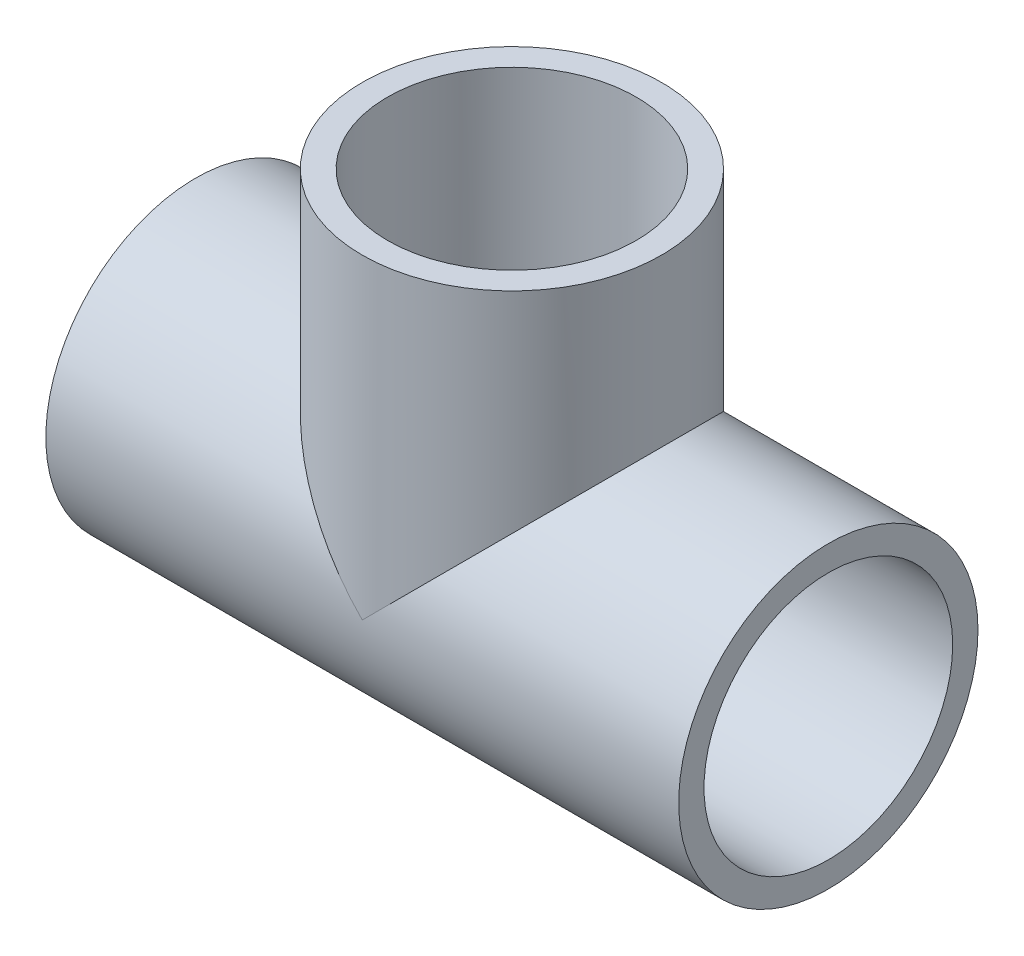
ISO-10303-21;
HEADER;
FILE_DESCRIPTION(('STEP AP214'),'2;1');
FILE_NAME('part.step','',(''),(''),'','','');
FILE_SCHEMA(('AUTOMOTIVE_DESIGN { 1 0 10303 214 1 1 1 1 }'));
ENDSEC;
DATA;
#1=APPLICATION_CONTEXT('core data for automotive mechanical design processes');
#2=APPLICATION_PROTOCOL_DEFINITION('international standard','automotive_design',2000,#1);
#3=PRODUCT_CONTEXT('',#1,'mechanical');
#4=PRODUCT('Part','Part','',(#3));
#5=PRODUCT_RELATED_PRODUCT_CATEGORY('part','',(#4));
#6=PRODUCT_DEFINITION_FORMATION('','',#4);
#7=PRODUCT_DEFINITION_CONTEXT('part definition',#1,'design');
#8=PRODUCT_DEFINITION('design','',#6,#7);
#9=PRODUCT_DEFINITION_SHAPE('','',#8);
#10=(LENGTH_UNIT() NAMED_UNIT(*) SI_UNIT(.MILLI.,.METRE.));
#11=(NAMED_UNIT(*) PLANE_ANGLE_UNIT() SI_UNIT($,.RADIAN.));
#12=(NAMED_UNIT(*) SI_UNIT($,.STERADIAN.) SOLID_ANGLE_UNIT());
#13=UNCERTAINTY_MEASURE_WITH_UNIT(LENGTH_MEASURE(1.E-05),#10,'distance_accuracy_value','');
#14=(GEOMETRIC_REPRESENTATION_CONTEXT(3) GLOBAL_UNCERTAINTY_ASSIGNED_CONTEXT((#13)) GLOBAL_UNIT_ASSIGNED_CONTEXT((#10,
#11,#12)) REPRESENTATION_CONTEXT('',''));
#15=CARTESIAN_POINT('',(0.,0.,0.));
#16=DIRECTION('',(0.,0.,1.));
#17=DIRECTION('',(1.,0.,0.));
#18=AXIS2_PLACEMENT_3D('',#15,#16,#17);
#19=CARTESIAN_POINT('',(85.,0.,0.));
#20=DIRECTION('',(-1.,0.,0.));
#21=DIRECTION('',(0.,0.,1.));
#22=AXIS2_PLACEMENT_3D('',#19,#20,#21);
#23=CYLINDRICAL_SURFACE('',#22,20.1);
#24=CARTESIAN_POINT('',(0.,0.,0.));
#25=DIRECTION('',(1.,0.,0.));
#26=DIRECTION('',(0.,0.,-1.));
#27=AXIS2_PLACEMENT_3D('',#24,#25,#26);
#28=CIRCLE('',#27,20.1);
#29=CARTESIAN_POINT('',(0.,0.,-20.1));
#30=VERTEX_POINT('',#29);
#31=EDGE_CURVE('E141',#30,#30,#28,.T.);
#32=ORIENTED_EDGE('',*,*,#31,.T.);
#33=EDGE_LOOP('',(#32));
#34=FACE_BOUND('',#33,.T.);
#35=CARTESIAN_POINT('',(85.,0.,0.));
#36=DIRECTION('',(1.,0.,0.));
#37=DIRECTION('',(0.,0.,-1.));
#38=AXIS2_PLACEMENT_3D('',#35,#36,#37);
#39=CIRCLE('',#38,20.1);
#40=CARTESIAN_POINT('',(85.,0.,-20.1));
#41=VERTEX_POINT('',#40);
#42=EDGE_CURVE('E138',#41,#41,#39,.T.);
#43=ORIENTED_EDGE('',*,*,#42,.F.);
#44=EDGE_LOOP('',(#43));
#45=FACE_BOUND('',#44,.T.);
#46=CARTESIAN_POINT('',(42.5,0.,0.));
#47=DIRECTION('',(-0.707106781186547,-0.707106781186547,0.));
#48=DIRECTION('',(-0.707106781186547,0.707106781186547,0.));
#49=AXIS2_PLACEMENT_3D('',#46,#47,#48);
#50=ELLIPSE('',#49,28.4256926036992,20.1);
#51=CARTESIAN_POINT('',(42.5,0.,-20.1));
#52=VERTEX_POINT('',#51);
#53=CARTESIAN_POINT('',(42.5,0.,20.1));
#54=VERTEX_POINT('',#53);
#55=EDGE_CURVE('E153',#52,#54,#50,.F.);
#56=ORIENTED_EDGE('',*,*,#55,.F.);
#57=CARTESIAN_POINT('',(42.5,0.,0.));
#58=DIRECTION('',(-0.707106781186547,0.707106781186547,0.));
#59=DIRECTION('',(-0.707106781186547,-0.707106781186547,0.));
#60=AXIS2_PLACEMENT_3D('',#57,#58,#59);
#61=ELLIPSE('',#60,28.4256926036992,20.1);
#62=EDGE_CURVE('E160',#54,#52,#61,.T.);
#63=ORIENTED_EDGE('',*,*,#62,.F.);
#64=EDGE_LOOP('',(#56,#63));
#65=FACE_BOUND('',#64,.T.);
#66=ADVANCED_FACE('F38',(#34,#45,#65),#23,.T.);
#67=CARTESIAN_POINT('',(85.,0.,0.));
#68=DIRECTION('',(1.,0.,0.));
#69=DIRECTION('',(0.,0.,-1.));
#70=AXIS2_PLACEMENT_3D('',#67,#68,#69);
#71=PLANE('',#70);
#72=ORIENTED_EDGE('',*,*,#42,.T.);
#73=EDGE_LOOP('',(#72));
#74=FACE_BOUND('',#73,.T.);
#75=CARTESIAN_POINT('',(85.,0.,0.));
#76=DIRECTION('',(1.,0.,0.));
#77=DIRECTION('',(0.,0.,-1.));
#78=AXIS2_PLACEMENT_3D('',#75,#76,#77);
#79=CIRCLE('',#78,16.7);
#80=CARTESIAN_POINT('',(85.,0.,-16.7));
#81=VERTEX_POINT('',#80);
#82=EDGE_CURVE('E147',#81,#81,#79,.T.);
#83=ORIENTED_EDGE('',*,*,#82,.F.);
#84=EDGE_LOOP('',(#83));
#85=FACE_BOUND('',#84,.T.);
#86=ADVANCED_FACE('F120',(#74,#85),#71,.T.);
#87=CARTESIAN_POINT('',(0.,0.,0.));
#88=DIRECTION('',(1.,0.,0.));
#89=DIRECTION('',(0.,0.,-1.));
#90=AXIS2_PLACEMENT_3D('',#87,#88,#89);
#91=PLANE('',#90);
#92=ORIENTED_EDGE('',*,*,#31,.F.);
#93=EDGE_LOOP('',(#92));
#94=FACE_BOUND('',#93,.T.);
#95=CARTESIAN_POINT('',(0.,0.,0.));
#96=DIRECTION('',(1.,0.,0.));
#97=DIRECTION('',(0.,0.,-1.));
#98=AXIS2_PLACEMENT_3D('',#95,#96,#97);
#99=CIRCLE('',#98,16.7);
#100=CARTESIAN_POINT('',(0.,0.,-16.7));
#101=VERTEX_POINT('',#100);
#102=EDGE_CURVE('E149',#101,#101,#99,.T.);
#103=ORIENTED_EDGE('',*,*,#102,.T.);
#104=EDGE_LOOP('',(#103));
#105=FACE_BOUND('',#104,.T.);
#106=ADVANCED_FACE('F201',(#94,#105),#91,.F.);
#107=CARTESIAN_POINT('',(42.5,42.44,0.));
#108=DIRECTION('',(0.,-1.,0.));
#109=DIRECTION('',(0.,0.,-1.));
#110=AXIS2_PLACEMENT_3D('',#107,#108,#109);
#111=CYLINDRICAL_SURFACE('',#110,20.1);
#112=CARTESIAN_POINT('',(42.5,42.44,0.));
#113=DIRECTION('',(0.,1.,0.));
#114=DIRECTION('',(0.,0.,1.));
#115=AXIS2_PLACEMENT_3D('',#112,#113,#114);
#116=CIRCLE('',#115,20.1);
#117=CARTESIAN_POINT('',(42.5,42.44,20.1));
#118=VERTEX_POINT('',#117);
#119=EDGE_CURVE('E164',#118,#118,#116,.T.);
#120=ORIENTED_EDGE('',*,*,#119,.F.);
#121=EDGE_LOOP('',(#120));
#122=FACE_BOUND('',#121,.T.);
#123=ORIENTED_EDGE('',*,*,#62,.T.);
#124=ORIENTED_EDGE('',*,*,#55,.T.);
#125=EDGE_LOOP('',(#123,#124));
#126=FACE_BOUND('',#125,.T.);
#127=ADVANCED_FACE('F118',(#122,#126),#111,.T.);
#128=CARTESIAN_POINT('',(42.5,42.44,0.));
#129=DIRECTION('',(0.,-1.,0.));
#130=DIRECTION('',(0.,0.,-1.));
#131=AXIS2_PLACEMENT_3D('',#128,#129,#130);
#132=CYLINDRICAL_SURFACE('',#131,16.7);
#133=CARTESIAN_POINT('',(42.5,42.44,0.));
#134=DIRECTION('',(0.,1.,0.));
#135=DIRECTION('',(0.,0.,1.));
#136=AXIS2_PLACEMENT_3D('',#133,#134,#135);
#137=CIRCLE('',#136,16.7);
#138=CARTESIAN_POINT('',(42.5,42.44,16.7));
#139=VERTEX_POINT('',#138);
#140=EDGE_CURVE('E168',#139,#139,#137,.T.);
#141=ORIENTED_EDGE('',*,*,#140,.T.);
#142=EDGE_LOOP('',(#141));
#143=FACE_BOUND('',#142,.T.);
#144=CARTESIAN_POINT('',(42.5,0.,0.));
#145=DIRECTION('',(-0.707106781186548,0.707106781186547,0.));
#146=DIRECTION('',(-0.707106781186548,-0.707106781186547,0.));
#147=AXIS2_PLACEMENT_3D('',#144,#145,#146);
#148=ELLIPSE('',#147,23.6173664916307,16.7);
#149=CARTESIAN_POINT('',(42.5,0.,-16.7));
#150=VERTEX_POINT('',#149);
#151=CARTESIAN_POINT('',(42.5,0.,16.7));
#152=VERTEX_POINT('',#151);
#153=EDGE_CURVE('E84',#150,#152,#148,.F.);
#154=ORIENTED_EDGE('',*,*,#153,.T.);
#155=CARTESIAN_POINT('',(42.5,0.,0.));
#156=DIRECTION('',(-0.707106781186548,-0.707106781186547,0.));
#157=DIRECTION('',(-0.707106781186548,0.707106781186547,0.));
#158=AXIS2_PLACEMENT_3D('',#155,#156,#157);
#159=ELLIPSE('',#158,23.6173664916307,16.7);
#160=EDGE_CURVE('E97',#152,#150,#159,.T.);
#161=ORIENTED_EDGE('',*,*,#160,.T.);
#162=EDGE_LOOP('',(#154,#161));
#163=FACE_BOUND('',#162,.T.);
#164=ADVANCED_FACE('F182',(#143,#163),#132,.F.);
#165=CARTESIAN_POINT('',(42.5,42.44,0.));
#166=DIRECTION('',(0.,1.,0.));
#167=DIRECTION('',(0.,0.,1.));
#168=AXIS2_PLACEMENT_3D('',#165,#166,#167);
#169=PLANE('',#168);
#170=ORIENTED_EDGE('',*,*,#119,.T.);
#171=EDGE_LOOP('',(#170));
#172=FACE_BOUND('',#171,.T.);
#173=ORIENTED_EDGE('',*,*,#140,.F.);
#174=EDGE_LOOP('',(#173));
#175=FACE_BOUND('',#174,.T.);
#176=ADVANCED_FACE('F117',(#172,#175),#169,.T.);
#177=CARTESIAN_POINT('',(85.,0.,0.));
#178=DIRECTION('',(-1.,0.,0.));
#179=DIRECTION('',(0.,0.,1.));
#180=AXIS2_PLACEMENT_3D('',#177,#178,#179);
#181=CYLINDRICAL_SURFACE('',#180,16.7);
#182=CARTESIAN_POINT('',(42.5,0.,0.));
#183=DIRECTION('',(-0.707106781186548,-0.707106781186547,0.));
#184=DIRECTION('',(-0.707106781186548,0.707106781186547,0.));
#185=AXIS2_PLACEMENT_3D('',#182,#183,#184);
#186=ELLIPSE('',#185,23.6173664916307,16.7);
#187=CARTESIAN_POINT('',(42.5574383669624,-0.0574383669606007,-16.6999012222828));
#188=VERTEX_POINT('',#187);
#189=EDGE_CURVE('E11',#188,#150,#186,.F.);
#190=ORIENTED_EDGE('',*,*,#189,.F.);
#191=CARTESIAN_POINT('',(42.5574383669624,-0.0574383669605945,-16.6999012222828));
#192=DIRECTION('',(-1.,0.,0.));
#193=VECTOR('',#192,1.);
#194=LINE('',#191,#193);
#195=CARTESIAN_POINT('',(42.4425616330375,-0.0574383669606007,-16.6999012222828));
#196=VERTEX_POINT('',#195);
#197=EDGE_CURVE('E48',#188,#196,#194,.T.);
#198=ORIENTED_EDGE('',*,*,#197,.T.);
#199=CARTESIAN_POINT('',(42.5,0.,0.));
#200=DIRECTION('',(-0.707106781186548,0.707106781186547,0.));
#201=DIRECTION('',(-0.707106781186548,-0.707106781186547,0.));
#202=AXIS2_PLACEMENT_3D('',#199,#200,#201);
#203=ELLIPSE('',#202,23.6173664916307,16.7);
#204=EDGE_CURVE('E41',#150,#196,#203,.T.);
#205=ORIENTED_EDGE('',*,*,#204,.F.);
#206=ORIENTED_EDGE('',*,*,#160,.F.);
#207=CARTESIAN_POINT('',(42.4425616330375,-0.0574383669606007,16.6999012222828));
#208=VERTEX_POINT('',#207);
#209=EDGE_CURVE('E94',#208,#152,#203,.T.);
#210=ORIENTED_EDGE('',*,*,#209,.F.);
#211=CARTESIAN_POINT('',(42.4425616330375,-0.057438366960608,16.6999012222828));
#212=DIRECTION('',(1.,0.,0.));
#213=VECTOR('',#212,1.);
#214=LINE('',#211,#213);
#215=CARTESIAN_POINT('',(42.5574383669624,-0.0574383669606007,16.6999012222828));
#216=VERTEX_POINT('',#215);
#217=EDGE_CURVE('E101',#208,#216,#214,.T.);
#218=ORIENTED_EDGE('',*,*,#217,.T.);
#219=EDGE_CURVE('E61',#152,#216,#186,.F.);
#220=ORIENTED_EDGE('',*,*,#219,.F.);
#221=ORIENTED_EDGE('',*,*,#153,.F.);
#222=EDGE_LOOP('',(#190,#198,#205,#206,#210,#218,#220,#221));
#223=FACE_BOUND('',#222,.T.);
#224=ORIENTED_EDGE('',*,*,#102,.F.);
#225=EDGE_LOOP('',(#224));
#226=FACE_BOUND('',#225,.T.);
#227=ORIENTED_EDGE('',*,*,#82,.T.);
#228=EDGE_LOOP('',(#227));
#229=FACE_BOUND('',#228,.T.);
#230=ADVANCED_FACE('F88',(#223,#226,#229),#181,.F.);
#231=CARTESIAN_POINT('',(42.5,-0.0574383669606007,0.));
#232=DIRECTION('',(0.,1.,0.));
#233=DIRECTION('',(0.,0.,1.));
#234=AXIS2_PLACEMENT_3D('',#231,#232,#233);
#235=CYLINDRICAL_SURFACE('',#234,16.7);
#236=ORIENTED_EDGE('',*,*,#219,.T.);
#237=ORIENTED_EDGE('',*,*,#217,.F.);
#238=ORIENTED_EDGE('',*,*,#209,.T.);
#239=EDGE_LOOP('',(#236,#237,#238));
#240=FACE_BOUND('',#239,.T.);
#241=ADVANCED_FACE('F116',(#240),#235,.F.);
#242=ORIENTED_EDGE('',*,*,#204,.T.);
#243=ORIENTED_EDGE('',*,*,#197,.F.);
#244=ORIENTED_EDGE('',*,*,#189,.T.);
#245=EDGE_LOOP('',(#242,#243,#244));
#246=FACE_BOUND('',#245,.T.);
#247=ADVANCED_FACE('F79',(#246),#235,.F.);
#248=CLOSED_SHELL('',(#66,#86,#106,#127,#164,#176,#230,#241,#247));
#249=MANIFOLD_SOLID_BREP('B2',#248);
#250=ADVANCED_BREP_SHAPE_REPRESENTATION('',(#18,#249),#14);
#251=SHAPE_DEFINITION_REPRESENTATION(#9,#250);
ENDSEC;
END-ISO-10303-21;
